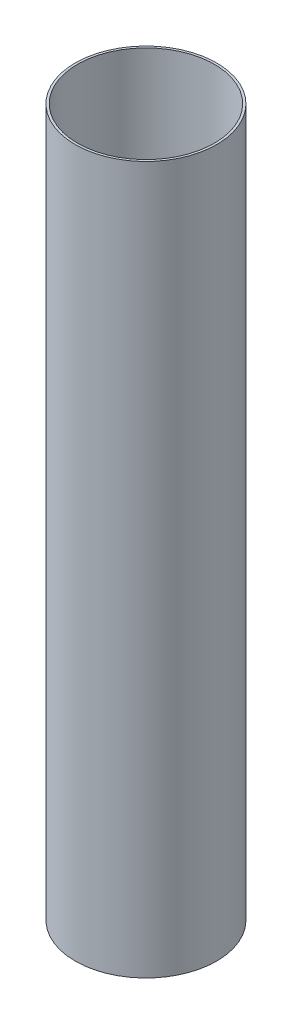
ISO-10303-21;
HEADER;
FILE_DESCRIPTION(('STEP AP214'),'2;1');
FILE_NAME('part.step','',(''),(''),'','','');
FILE_SCHEMA(('AUTOMOTIVE_DESIGN { 1 0 10303 214 1 1 1 1 }'));
ENDSEC;
DATA;
#1=APPLICATION_CONTEXT('core data for automotive mechanical design processes');
#2=APPLICATION_PROTOCOL_DEFINITION('international standard','automotive_design',2000,#1);
#3=PRODUCT_CONTEXT('',#1,'mechanical');
#4=PRODUCT('Part','Part','',(#3));
#5=PRODUCT_RELATED_PRODUCT_CATEGORY('part','',(#4));
#6=PRODUCT_DEFINITION_FORMATION('','',#4);
#7=PRODUCT_DEFINITION_CONTEXT('part definition',#1,'design');
#8=PRODUCT_DEFINITION('design','',#6,#7);
#9=PRODUCT_DEFINITION_SHAPE('','',#8);
#10=(LENGTH_UNIT() NAMED_UNIT(*) SI_UNIT(.MILLI.,.METRE.));
#11=(NAMED_UNIT(*) PLANE_ANGLE_UNIT() SI_UNIT($,.RADIAN.));
#12=(NAMED_UNIT(*) SI_UNIT($,.STERADIAN.) SOLID_ANGLE_UNIT());
#13=UNCERTAINTY_MEASURE_WITH_UNIT(LENGTH_MEASURE(1.E-05),#10,'distance_accuracy_value','');
#14=(GEOMETRIC_REPRESENTATION_CONTEXT(3) GLOBAL_UNCERTAINTY_ASSIGNED_CONTEXT((#13)) GLOBAL_UNIT_ASSIGNED_CONTEXT((#10,
#11,#12)) REPRESENTATION_CONTEXT('',''));
#15=CARTESIAN_POINT('',(0.,0.,0.));
#16=DIRECTION('',(0.,0.,1.));
#17=DIRECTION('',(1.,0.,0.));
#18=AXIS2_PLACEMENT_3D('',#15,#16,#17);
#19=CARTESIAN_POINT('',(0.,310.,0.));
#20=DIRECTION('',(0.,-1.,0.));
#21=DIRECTION('',(0.,0.,-1.));
#22=AXIS2_PLACEMENT_3D('',#19,#20,#21);
#23=CYLINDRICAL_SURFACE('',#22,31.);
#24=CARTESIAN_POINT('',(0.,310.,0.));
#25=DIRECTION('',(0.,1.,0.));
#26=DIRECTION('',(0.,0.,1.));
#27=AXIS2_PLACEMENT_3D('',#24,#25,#26);
#28=CIRCLE('',#27,31.);
#29=CARTESIAN_POINT('',(0.,310.,31.));
#30=VERTEX_POINT('',#29);
#31=EDGE_CURVE('E10',#30,#30,#28,.T.);
#32=ORIENTED_EDGE('',*,*,#31,.F.);
#33=EDGE_LOOP('',(#32));
#34=FACE_BOUND('',#33,.T.);
#35=CARTESIAN_POINT('',(0.,0.,0.));
#36=DIRECTION('',(0.,1.,0.));
#37=DIRECTION('',(0.,0.,1.));
#38=AXIS2_PLACEMENT_3D('',#35,#36,#37);
#39=CIRCLE('',#38,31.);
#40=CARTESIAN_POINT('',(0.,0.,31.));
#41=VERTEX_POINT('',#40);
#42=EDGE_CURVE('E39',#41,#41,#39,.T.);
#43=ORIENTED_EDGE('',*,*,#42,.T.);
#44=EDGE_LOOP('',(#43));
#45=FACE_BOUND('',#44,.T.);
#46=ADVANCED_FACE('F36',(#34,#45),#23,.T.);
#47=CARTESIAN_POINT('',(0.,310.,0.));
#48=DIRECTION('',(0.,1.,0.));
#49=DIRECTION('',(0.,0.,1.));
#50=AXIS2_PLACEMENT_3D('',#47,#48,#49);
#51=PLANE('',#50);
#52=CARTESIAN_POINT('',(0.,310.,0.));
#53=DIRECTION('',(0.,1.,0.));
#54=DIRECTION('',(0.,0.,1.));
#55=AXIS2_PLACEMENT_3D('',#52,#53,#54);
#56=CIRCLE('',#55,30.);
#57=CARTESIAN_POINT('',(0.,310.,30.));
#58=VERTEX_POINT('',#57);
#59=EDGE_CURVE('E50',#58,#58,#56,.T.);
#60=ORIENTED_EDGE('',*,*,#59,.F.);
#61=EDGE_LOOP('',(#60));
#62=FACE_BOUND('',#61,.T.);
#63=ORIENTED_EDGE('',*,*,#31,.T.);
#64=EDGE_LOOP('',(#63));
#65=FACE_BOUND('',#64,.T.);
#66=ADVANCED_FACE('F67',(#62,#65),#51,.T.);
#67=CARTESIAN_POINT('',(0.,0.,0.));
#68=DIRECTION('',(0.,1.,0.));
#69=DIRECTION('',(0.,0.,1.));
#70=AXIS2_PLACEMENT_3D('',#67,#68,#69);
#71=PLANE('',#70);
#72=ORIENTED_EDGE('',*,*,#42,.F.);
#73=EDGE_LOOP('',(#72));
#74=FACE_BOUND('',#73,.T.);
#75=ADVANCED_FACE('F63',(#74),#71,.F.);
#76=CARTESIAN_POINT('',(0.,10.,0.));
#77=DIRECTION('',(0.,1.,0.));
#78=DIRECTION('',(0.,0.,1.));
#79=AXIS2_PLACEMENT_3D('',#76,#77,#78);
#80=CYLINDRICAL_SURFACE('',#79,30.);
#81=CARTESIAN_POINT('',(0.,10.,0.));
#82=DIRECTION('',(0.,1.,0.));
#83=DIRECTION('',(0.,0.,1.));
#84=AXIS2_PLACEMENT_3D('',#81,#82,#83);
#85=CIRCLE('',#84,30.);
#86=CARTESIAN_POINT('',(0.,10.,30.));
#87=VERTEX_POINT('',#86);
#88=EDGE_CURVE('E48',#87,#87,#85,.T.);
#89=ORIENTED_EDGE('',*,*,#88,.F.);
#90=EDGE_LOOP('',(#89));
#91=FACE_BOUND('',#90,.T.);
#92=ORIENTED_EDGE('',*,*,#59,.T.);
#93=EDGE_LOOP('',(#92));
#94=FACE_BOUND('',#93,.T.);
#95=ADVANCED_FACE('F60',(#91,#94),#80,.F.);
#96=CARTESIAN_POINT('',(0.,10.,0.));
#97=DIRECTION('',(0.,1.,0.));
#98=DIRECTION('',(0.,0.,1.));
#99=AXIS2_PLACEMENT_3D('',#96,#97,#98);
#100=PLANE('',#99);
#101=ORIENTED_EDGE('',*,*,#88,.T.);
#102=EDGE_LOOP('',(#101));
#103=FACE_BOUND('',#102,.T.);
#104=ADVANCED_FACE('F58',(#103),#100,.T.);
#105=CLOSED_SHELL('',(#46,#66,#75,#95,#104));
#106=MANIFOLD_SOLID_BREP('B2',#105);
#107=ADVANCED_BREP_SHAPE_REPRESENTATION('',(#18,#106),#14);
#108=SHAPE_DEFINITION_REPRESENTATION(#9,#107);
ENDSEC;
END-ISO-10303-21;
